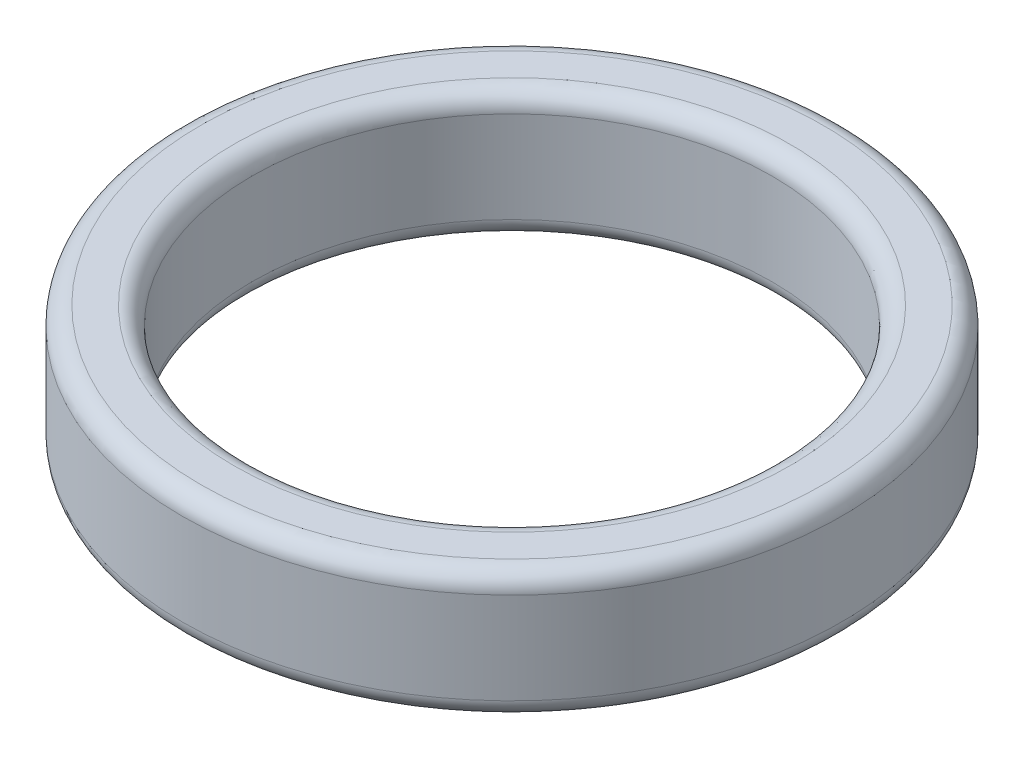
ISO-10303-21;
HEADER;
FILE_DESCRIPTION(('STEP AP214'),'2;1');
FILE_NAME('part.step','',(''),(''),'','','');
FILE_SCHEMA(('AUTOMOTIVE_DESIGN { 1 0 10303 214 1 1 1 1 }'));
ENDSEC;
DATA;
#1=APPLICATION_CONTEXT('core data for automotive mechanical design processes');
#2=APPLICATION_PROTOCOL_DEFINITION('international standard','automotive_design',2000,#1);
#3=PRODUCT_CONTEXT('',#1,'mechanical');
#4=PRODUCT('Part','Part','',(#3));
#5=PRODUCT_RELATED_PRODUCT_CATEGORY('part','',(#4));
#6=PRODUCT_DEFINITION_FORMATION('','',#4);
#7=PRODUCT_DEFINITION_CONTEXT('part definition',#1,'design');
#8=PRODUCT_DEFINITION('design','',#6,#7);
#9=PRODUCT_DEFINITION_SHAPE('','',#8);
#10=(LENGTH_UNIT() NAMED_UNIT(*) SI_UNIT(.MILLI.,.METRE.));
#11=(NAMED_UNIT(*) PLANE_ANGLE_UNIT() SI_UNIT($,.RADIAN.));
#12=(NAMED_UNIT(*) SI_UNIT($,.STERADIAN.) SOLID_ANGLE_UNIT());
#13=UNCERTAINTY_MEASURE_WITH_UNIT(LENGTH_MEASURE(1.E-05),#10,'distance_accuracy_value','');
#14=(GEOMETRIC_REPRESENTATION_CONTEXT(3) GLOBAL_UNCERTAINTY_ASSIGNED_CONTEXT((#13)) GLOBAL_UNIT_ASSIGNED_CONTEXT((#10,
#11,#12)) REPRESENTATION_CONTEXT('',''));
#15=CARTESIAN_POINT('',(0.,0.,0.));
#16=DIRECTION('',(0.,0.,1.));
#17=DIRECTION('',(1.,0.,0.));
#18=AXIS2_PLACEMENT_3D('',#15,#16,#17);
#19=CARTESIAN_POINT('',(0.,3.5,0.));
#20=DIRECTION('',(0.,1.,0.));
#21=DIRECTION('',(0.,0.,1.));
#22=AXIS2_PLACEMENT_3D('',#19,#20,#21);
#23=PLANE('',#22);
#24=CARTESIAN_POINT('',(0.,3.5,0.));
#25=DIRECTION('',(0.,1.,0.));
#26=DIRECTION('',(0.,0.,1.));
#27=AXIS2_PLACEMENT_3D('',#24,#25,#26);
#28=CIRCLE('',#27,7.6);
#29=CARTESIAN_POINT('',(0.,3.5,7.6));
#30=VERTEX_POINT('',#29);
#31=EDGE_CURVE('E45',#30,#30,#28,.F.);
#32=ORIENTED_EDGE('',*,*,#31,.T.);
#33=EDGE_LOOP('',(#32));
#34=FACE_BOUND('',#33,.T.);
#35=CARTESIAN_POINT('',(0.,3.5,0.));
#36=DIRECTION('',(0.,1.,0.));
#37=DIRECTION('',(0.,0.,1.));
#38=AXIS2_PLACEMENT_3D('',#35,#36,#37);
#39=CIRCLE('',#38,8.5);
#40=CARTESIAN_POINT('',(0.,3.5,8.5));
#41=VERTEX_POINT('',#40);
#42=EDGE_CURVE('E49',#41,#41,#39,.T.);
#43=ORIENTED_EDGE('',*,*,#42,.T.);
#44=EDGE_LOOP('',(#43));
#45=FACE_BOUND('',#44,.T.);
#46=ADVANCED_FACE('F34',(#34,#45),#23,.T.);
#47=CARTESIAN_POINT('',(0.,0.,0.));
#48=DIRECTION('',(0.,1.,0.));
#49=DIRECTION('',(0.,0.,1.));
#50=AXIS2_PLACEMENT_3D('',#47,#48,#49);
#51=PLANE('',#50);
#52=CARTESIAN_POINT('',(0.,0.,0.));
#53=DIRECTION('',(0.,1.,0.));
#54=DIRECTION('',(0.,0.,1.));
#55=AXIS2_PLACEMENT_3D('',#52,#53,#54);
#56=CIRCLE('',#55,7.6);
#57=CARTESIAN_POINT('',(0.,0.,7.6));
#58=VERTEX_POINT('',#57);
#59=EDGE_CURVE('E60',#58,#58,#56,.T.);
#60=ORIENTED_EDGE('',*,*,#59,.T.);
#61=EDGE_LOOP('',(#60));
#62=FACE_BOUND('',#61,.T.);
#63=CARTESIAN_POINT('',(0.,0.,0.));
#64=DIRECTION('',(0.,1.,0.));
#65=DIRECTION('',(0.,0.,1.));
#66=AXIS2_PLACEMENT_3D('',#63,#64,#65);
#67=CIRCLE('',#66,8.5);
#68=CARTESIAN_POINT('',(0.,0.,8.5));
#69=VERTEX_POINT('',#68);
#70=EDGE_CURVE('E63',#69,#69,#67,.F.);
#71=ORIENTED_EDGE('',*,*,#70,.T.);
#72=EDGE_LOOP('',(#71));
#73=FACE_BOUND('',#72,.T.);
#74=ADVANCED_FACE('F67',(#62,#73),#51,.F.);
#75=CARTESIAN_POINT('',(0.,3.5,0.));
#76=DIRECTION('',(0.,-1.,0.));
#77=DIRECTION('',(0.,0.,-1.));
#78=AXIS2_PLACEMENT_3D('',#75,#76,#77);
#79=CYLINDRICAL_SURFACE('',#78,9.);
#80=CARTESIAN_POINT('',(0.,0.5,0.));
#81=DIRECTION('',(0.,1.,0.));
#82=DIRECTION('',(0.,0.,1.));
#83=AXIS2_PLACEMENT_3D('',#80,#81,#82);
#84=CIRCLE('',#83,9.);
#85=CARTESIAN_POINT('',(0.,0.5,9.));
#86=VERTEX_POINT('',#85);
#87=EDGE_CURVE('E10',#86,#86,#84,.T.);
#88=ORIENTED_EDGE('',*,*,#87,.T.);
#89=EDGE_LOOP('',(#88));
#90=FACE_BOUND('',#89,.T.);
#91=CARTESIAN_POINT('',(0.,3.,0.));
#92=DIRECTION('',(0.,1.,0.));
#93=DIRECTION('',(0.,0.,1.));
#94=AXIS2_PLACEMENT_3D('',#91,#92,#93);
#95=CIRCLE('',#94,9.);
#96=CARTESIAN_POINT('',(0.,3.,9.));
#97=VERTEX_POINT('',#96);
#98=EDGE_CURVE('E41',#97,#97,#95,.F.);
#99=ORIENTED_EDGE('',*,*,#98,.T.);
#100=EDGE_LOOP('',(#99));
#101=FACE_BOUND('',#100,.T.);
#102=ADVANCED_FACE('F87',(#90,#101),#79,.T.);
#103=CARTESIAN_POINT('',(0.,3.5,0.));
#104=DIRECTION('',(0.,-1.,0.));
#105=DIRECTION('',(0.,0.,-1.));
#106=AXIS2_PLACEMENT_3D('',#103,#104,#105);
#107=CYLINDRICAL_SURFACE('',#106,7.1);
#108=CARTESIAN_POINT('',(0.,0.5,0.));
#109=DIRECTION('',(0.,1.,0.));
#110=DIRECTION('',(0.,0.,1.));
#111=AXIS2_PLACEMENT_3D('',#108,#109,#110);
#112=CIRCLE('',#111,7.1);
#113=CARTESIAN_POINT('',(0.,0.5,7.1));
#114=VERTEX_POINT('',#113);
#115=EDGE_CURVE('E54',#114,#114,#112,.F.);
#116=ORIENTED_EDGE('',*,*,#115,.T.);
#117=EDGE_LOOP('',(#116));
#118=FACE_BOUND('',#117,.T.);
#119=CARTESIAN_POINT('',(0.,3.,0.));
#120=DIRECTION('',(0.,1.,0.));
#121=DIRECTION('',(0.,0.,1.));
#122=AXIS2_PLACEMENT_3D('',#119,#120,#121);
#123=CIRCLE('',#122,7.1);
#124=CARTESIAN_POINT('',(0.,3.,7.1));
#125=VERTEX_POINT('',#124);
#126=EDGE_CURVE('E57',#125,#125,#123,.T.);
#127=ORIENTED_EDGE('',*,*,#126,.T.);
#128=EDGE_LOOP('',(#127));
#129=FACE_BOUND('',#128,.T.);
#130=ADVANCED_FACE('F92',(#118,#129),#107,.F.);
#131=CARTESIAN_POINT('',(0.,0.5,0.));
#132=DIRECTION('',(0.,1.,0.));
#133=DIRECTION('',(0.,0.,1.));
#134=AXIS2_PLACEMENT_3D('',#131,#132,#133);
#135=TOROIDAL_SURFACE('',#134,7.6,0.5);
#136=ORIENTED_EDGE('',*,*,#115,.F.);
#137=EDGE_LOOP('',(#136));
#138=FACE_BOUND('',#137,.T.);
#139=ORIENTED_EDGE('',*,*,#59,.F.);
#140=EDGE_LOOP('',(#139));
#141=FACE_BOUND('',#140,.T.);
#142=ADVANCED_FACE('F78',(#138,#141),#135,.T.);
#143=CARTESIAN_POINT('',(0.,3.,0.));
#144=DIRECTION('',(0.,1.,0.));
#145=DIRECTION('',(0.,0.,1.));
#146=AXIS2_PLACEMENT_3D('',#143,#144,#145);
#147=TOROIDAL_SURFACE('',#146,7.6,0.5);
#148=ORIENTED_EDGE('',*,*,#31,.F.);
#149=EDGE_LOOP('',(#148));
#150=FACE_BOUND('',#149,.T.);
#151=ORIENTED_EDGE('',*,*,#126,.F.);
#152=EDGE_LOOP('',(#151));
#153=FACE_BOUND('',#152,.T.);
#154=ADVANCED_FACE('F72',(#150,#153),#147,.T.);
#155=CARTESIAN_POINT('',(0.,0.5,0.));
#156=DIRECTION('',(0.,1.,0.));
#157=DIRECTION('',(0.,0.,1.));
#158=AXIS2_PLACEMENT_3D('',#155,#156,#157);
#159=TOROIDAL_SURFACE('',#158,8.5,0.5);
#160=ORIENTED_EDGE('',*,*,#70,.F.);
#161=EDGE_LOOP('',(#160));
#162=FACE_BOUND('',#161,.T.);
#163=ORIENTED_EDGE('',*,*,#87,.F.);
#164=EDGE_LOOP('',(#163));
#165=FACE_BOUND('',#164,.T.);
#166=ADVANCED_FACE('F69',(#162,#165),#159,.T.);
#167=CARTESIAN_POINT('',(0.,3.,0.));
#168=DIRECTION('',(0.,1.,0.));
#169=DIRECTION('',(0.,0.,1.));
#170=AXIS2_PLACEMENT_3D('',#167,#168,#169);
#171=TOROIDAL_SURFACE('',#170,8.5,0.5);
#172=ORIENTED_EDGE('',*,*,#98,.F.);
#173=EDGE_LOOP('',(#172));
#174=FACE_BOUND('',#173,.T.);
#175=ORIENTED_EDGE('',*,*,#42,.F.);
#176=EDGE_LOOP('',(#175));
#177=FACE_BOUND('',#176,.T.);
#178=ADVANCED_FACE('F36',(#174,#177),#171,.T.);
#179=CLOSED_SHELL('',(#46,#74,#102,#130,#142,#154,#166,#178));
#180=MANIFOLD_SOLID_BREP('B2',#179);
#181=ADVANCED_BREP_SHAPE_REPRESENTATION('',(#18,#180),#14);
#182=SHAPE_DEFINITION_REPRESENTATION(#9,#181);
ENDSEC;
END-ISO-10303-21;
